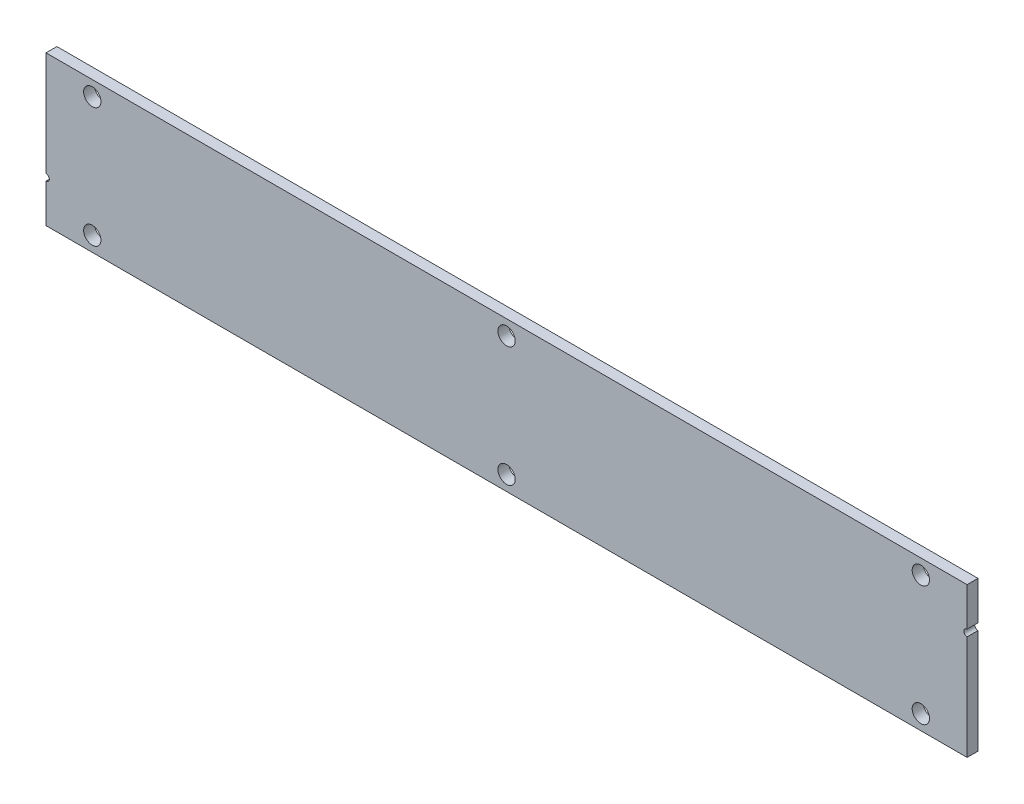
ISO-10303-21;
HEADER;
FILE_DESCRIPTION(('STEP AP214'),'2;1');
FILE_NAME('part.step','',(''),(''),'','','');
FILE_SCHEMA(('AUTOMOTIVE_DESIGN { 1 0 10303 214 1 1 1 1 }'));
ENDSEC;
DATA;
#1=APPLICATION_CONTEXT('core data for automotive mechanical design processes');
#2=APPLICATION_PROTOCOL_DEFINITION('international standard','automotive_design',2000,#1);
#3=PRODUCT_CONTEXT('',#1,'mechanical');
#4=PRODUCT('Part','Part','',(#3));
#5=PRODUCT_RELATED_PRODUCT_CATEGORY('part','',(#4));
#6=PRODUCT_DEFINITION_FORMATION('','',#4);
#7=PRODUCT_DEFINITION_CONTEXT('part definition',#1,'design');
#8=PRODUCT_DEFINITION('design','',#6,#7);
#9=PRODUCT_DEFINITION_SHAPE('','',#8);
#10=(LENGTH_UNIT() NAMED_UNIT(*) SI_UNIT(.MILLI.,.METRE.));
#11=(NAMED_UNIT(*) PLANE_ANGLE_UNIT() SI_UNIT($,.RADIAN.));
#12=(NAMED_UNIT(*) SI_UNIT($,.STERADIAN.) SOLID_ANGLE_UNIT());
#13=UNCERTAINTY_MEASURE_WITH_UNIT(LENGTH_MEASURE(1.E-05),#10,'distance_accuracy_value','');
#14=(GEOMETRIC_REPRESENTATION_CONTEXT(3) GLOBAL_UNCERTAINTY_ASSIGNED_CONTEXT((#13)) GLOBAL_UNIT_ASSIGNED_CONTEXT((#10,
#11,#12)) REPRESENTATION_CONTEXT('',''));
#15=CARTESIAN_POINT('',(0.,0.,0.));
#16=DIRECTION('',(0.,0.,1.));
#17=DIRECTION('',(1.,0.,0.));
#18=AXIS2_PLACEMENT_3D('',#15,#16,#17);
#19=CARTESIAN_POINT('',(69.85,5.00000000000001,1.651));
#20=DIRECTION('',(0.,0.,-1.));
#21=DIRECTION('',(-1.,0.,0.));
#22=AXIS2_PLACEMENT_3D('',#19,#20,#21);
#23=CYLINDRICAL_SURFACE('',#22,0.499999999999999);
#24=CARTESIAN_POINT('',(69.85,5.00000000000001,0.));
#25=DIRECTION('',(0.,0.,1.));
#26=DIRECTION('',(1.,0.,0.));
#27=AXIS2_PLACEMENT_3D('',#24,#25,#26);
#28=CIRCLE('',#27,0.499999999999999);
#29=CARTESIAN_POINT('',(69.85,5.50000000000001,0.));
#30=VERTEX_POINT('',#29);
#31=CARTESIAN_POINT('',(69.85,4.50000000000001,0.));
#32=VERTEX_POINT('',#31);
#33=EDGE_CURVE('E192',#30,#32,#28,.T.);
#34=ORIENTED_EDGE('',*,*,#33,.F.);
#35=DIRECTION('',(0.,0.,-1.));
#36=VECTOR('',#35,1.);
#37=CARTESIAN_POINT('',(69.85,5.50000000000001,1.651));
#38=LINE('',#37,#36);
#39=CARTESIAN_POINT('',(69.85,5.50000000000001,1.651));
#40=VERTEX_POINT('',#39);
#41=EDGE_CURVE('E11',#40,#30,#38,.T.);
#42=ORIENTED_EDGE('',*,*,#41,.F.);
#43=CARTESIAN_POINT('',(69.85,5.00000000000001,1.651));
#44=DIRECTION('',(0.,0.,1.));
#45=DIRECTION('',(1.,0.,0.));
#46=AXIS2_PLACEMENT_3D('',#43,#44,#45);
#47=CIRCLE('',#46,0.499999999999999);
#48=CARTESIAN_POINT('',(69.85,4.50000000000001,1.651));
#49=VERTEX_POINT('',#48);
#50=EDGE_CURVE('E148',#40,#49,#47,.T.);
#51=ORIENTED_EDGE('',*,*,#50,.T.);
#52=DIRECTION('',(0.,0.,-1.));
#53=VECTOR('',#52,1.);
#54=CARTESIAN_POINT('',(69.85,4.50000000000001,1.651));
#55=LINE('',#54,#53);
#56=EDGE_CURVE('E90',#49,#32,#55,.T.);
#57=ORIENTED_EDGE('',*,*,#56,.T.);
#58=EDGE_LOOP('',(#34,#42,#51,#57));
#59=FACE_BOUND('',#58,.T.);
#60=ADVANCED_FACE('F39',(#59),#23,.F.);
#61=CARTESIAN_POINT('',(69.85,0.,1.651));
#62=DIRECTION('',(-1.,0.,0.));
#63=DIRECTION('',(0.,0.,1.));
#64=AXIS2_PLACEMENT_3D('',#61,#62,#63);
#65=PLANE('',#64);
#66=DIRECTION('',(0.,1.,0.));
#67=VECTOR('',#66,1.);
#68=CARTESIAN_POINT('',(69.85,0.,0.));
#69=LINE('',#68,#67);
#70=CARTESIAN_POINT('',(69.85,11.35,0.));
#71=VERTEX_POINT('',#70);
#72=EDGE_CURVE('E187',#30,#71,#69,.T.);
#73=ORIENTED_EDGE('',*,*,#72,.T.);
#74=DIRECTION('',(0.,0.,-1.));
#75=VECTOR('',#74,1.);
#76=CARTESIAN_POINT('',(69.85,11.35,1.651));
#77=LINE('',#76,#75);
#78=CARTESIAN_POINT('',(69.85,11.35,1.651));
#79=VERTEX_POINT('',#78);
#80=EDGE_CURVE('E48',#79,#71,#77,.T.);
#81=ORIENTED_EDGE('',*,*,#80,.F.);
#82=DIRECTION('',(0.,1.,0.));
#83=VECTOR('',#82,1.);
#84=CARTESIAN_POINT('',(69.85,0.,1.651));
#85=LINE('',#84,#83);
#86=EDGE_CURVE('E144',#40,#79,#85,.T.);
#87=ORIENTED_EDGE('',*,*,#86,.F.);
#88=ORIENTED_EDGE('',*,*,#41,.T.);
#89=EDGE_LOOP('',(#73,#81,#87,#88));
#90=FACE_BOUND('',#89,.T.);
#91=ADVANCED_FACE('F188',(#90),#65,.F.);
#92=CARTESIAN_POINT('',(0.,11.35,1.651));
#93=DIRECTION('',(0.,1.,0.));
#94=DIRECTION('',(-1.,0.,0.));
#95=AXIS2_PLACEMENT_3D('',#92,#93,#94);
#96=PLANE('',#95);
#97=DIRECTION('',(1.,0.,0.));
#98=VECTOR('',#97,1.);
#99=CARTESIAN_POINT('',(0.,11.35,0.));
#100=LINE('',#99,#98);
#101=CARTESIAN_POINT('',(-69.85,11.35,0.));
#102=VERTEX_POINT('',#101);
#103=EDGE_CURVE('E183',#102,#71,#100,.T.);
#104=ORIENTED_EDGE('',*,*,#103,.F.);
#105=DIRECTION('',(0.,0.,-1.));
#106=VECTOR('',#105,1.);
#107=CARTESIAN_POINT('',(-69.85,11.35,1.651));
#108=LINE('',#107,#106);
#109=CARTESIAN_POINT('',(-69.85,11.35,1.651));
#110=VERTEX_POINT('',#109);
#111=EDGE_CURVE('E175',#110,#102,#108,.T.);
#112=ORIENTED_EDGE('',*,*,#111,.F.);
#113=DIRECTION('',(1.,0.,0.));
#114=VECTOR('',#113,1.);
#115=CARTESIAN_POINT('',(0.,11.35,1.651));
#116=LINE('',#115,#114);
#117=EDGE_CURVE('E140',#110,#79,#116,.T.);
#118=ORIENTED_EDGE('',*,*,#117,.T.);
#119=ORIENTED_EDGE('',*,*,#80,.T.);
#120=EDGE_LOOP('',(#104,#112,#118,#119));
#121=FACE_BOUND('',#120,.T.);
#122=ADVANCED_FACE('F181',(#121),#96,.T.);
#123=CARTESIAN_POINT('',(-69.85,0.,1.651));
#124=DIRECTION('',(-1.,0.,0.));
#125=DIRECTION('',(0.,0.,1.));
#126=AXIS2_PLACEMENT_3D('',#123,#124,#125);
#127=PLANE('',#126);
#128=DIRECTION('',(0.,1.,0.));
#129=VECTOR('',#128,1.);
#130=CARTESIAN_POINT('',(-69.85,0.,0.));
#131=LINE('',#130,#129);
#132=CARTESIAN_POINT('',(-69.85,-4.5,0.));
#133=VERTEX_POINT('',#132);
#134=EDGE_CURVE('E199',#133,#102,#131,.T.);
#135=ORIENTED_EDGE('',*,*,#134,.F.);
#136=DIRECTION('',(0.,0.,-1.));
#137=VECTOR('',#136,1.);
#138=CARTESIAN_POINT('',(-69.85,-4.5,1.651));
#139=LINE('',#138,#137);
#140=CARTESIAN_POINT('',(-69.85,-4.5,1.651));
#141=VERTEX_POINT('',#140);
#142=EDGE_CURVE('E172',#141,#133,#139,.T.);
#143=ORIENTED_EDGE('',*,*,#142,.F.);
#144=DIRECTION('',(0.,1.,0.));
#145=VECTOR('',#144,1.);
#146=CARTESIAN_POINT('',(-69.85,0.,1.651));
#147=LINE('',#146,#145);
#148=EDGE_CURVE('E134',#141,#110,#147,.T.);
#149=ORIENTED_EDGE('',*,*,#148,.T.);
#150=ORIENTED_EDGE('',*,*,#111,.T.);
#151=EDGE_LOOP('',(#135,#143,#149,#150));
#152=FACE_BOUND('',#151,.T.);
#153=ADVANCED_FACE('F370',(#152),#127,.T.);
#154=CARTESIAN_POINT('',(-69.85,-5.,1.651));
#155=DIRECTION('',(0.,0.,-1.));
#156=DIRECTION('',(-1.,0.,0.));
#157=AXIS2_PLACEMENT_3D('',#154,#155,#156);
#158=CYLINDRICAL_SURFACE('',#157,0.499999999999999);
#159=CARTESIAN_POINT('',(-69.85,-5.,0.));
#160=DIRECTION('',(0.,0.,1.));
#161=DIRECTION('',(1.,0.,0.));
#162=AXIS2_PLACEMENT_3D('',#159,#160,#161);
#163=CIRCLE('',#162,0.499999999999999);
#164=CARTESIAN_POINT('',(-69.85,-5.49999999999999,0.));
#165=VERTEX_POINT('',#164);
#166=EDGE_CURVE('E203',#165,#133,#163,.T.);
#167=ORIENTED_EDGE('',*,*,#166,.F.);
#168=DIRECTION('',(0.,0.,-1.));
#169=VECTOR('',#168,1.);
#170=CARTESIAN_POINT('',(-69.85,-5.49999999999999,1.651));
#171=LINE('',#170,#169);
#172=CARTESIAN_POINT('',(-69.85,-5.49999999999999,1.651));
#173=VERTEX_POINT('',#172);
#174=EDGE_CURVE('E119',#173,#165,#171,.T.);
#175=ORIENTED_EDGE('',*,*,#174,.F.);
#176=CARTESIAN_POINT('',(-69.85,-5.,1.651));
#177=DIRECTION('',(0.,0.,1.));
#178=DIRECTION('',(1.,0.,0.));
#179=AXIS2_PLACEMENT_3D('',#176,#177,#178);
#180=CIRCLE('',#179,0.499999999999999);
#181=EDGE_CURVE('E131',#173,#141,#180,.T.);
#182=ORIENTED_EDGE('',*,*,#181,.T.);
#183=ORIENTED_EDGE('',*,*,#142,.T.);
#184=EDGE_LOOP('',(#167,#175,#182,#183));
#185=FACE_BOUND('',#184,.T.);
#186=ADVANCED_FACE('F368',(#185),#158,.F.);
#187=CARTESIAN_POINT('',(-69.85,-11.35,0.));
#188=VERTEX_POINT('',#187);
#189=EDGE_CURVE('E117',#188,#165,#131,.T.);
#190=ORIENTED_EDGE('',*,*,#189,.F.);
#191=DIRECTION('',(0.,0.,-1.));
#192=VECTOR('',#191,1.);
#193=CARTESIAN_POINT('',(-69.85,-11.35,1.651));
#194=LINE('',#193,#192);
#195=CARTESIAN_POINT('',(-69.85,-11.35,1.651));
#196=VERTEX_POINT('',#195);
#197=EDGE_CURVE('E111',#196,#188,#194,.T.);
#198=ORIENTED_EDGE('',*,*,#197,.F.);
#199=EDGE_CURVE('E115',#196,#173,#147,.T.);
#200=ORIENTED_EDGE('',*,*,#199,.T.);
#201=ORIENTED_EDGE('',*,*,#174,.T.);
#202=EDGE_LOOP('',(#190,#198,#200,#201));
#203=FACE_BOUND('',#202,.T.);
#204=ADVANCED_FACE('F113',(#203),#127,.T.);
#205=CARTESIAN_POINT('',(0.,-11.35,1.651));
#206=DIRECTION('',(0.,1.,0.));
#207=DIRECTION('',(0.,0.,1.));
#208=AXIS2_PLACEMENT_3D('',#205,#206,#207);
#209=PLANE('',#208);
#210=DIRECTION('',(1.,0.,0.));
#211=VECTOR('',#210,1.);
#212=CARTESIAN_POINT('',(0.,-11.35,0.));
#213=LINE('',#212,#211);
#214=CARTESIAN_POINT('',(69.85,-11.35,0.));
#215=VERTEX_POINT('',#214);
#216=EDGE_CURVE('E83',#188,#215,#213,.T.);
#217=ORIENTED_EDGE('',*,*,#216,.T.);
#218=DIRECTION('',(0.,0.,-1.));
#219=VECTOR('',#218,1.);
#220=CARTESIAN_POINT('',(69.85,-11.35,1.651));
#221=LINE('',#220,#219);
#222=CARTESIAN_POINT('',(69.85,-11.35,1.651));
#223=VERTEX_POINT('',#222);
#224=EDGE_CURVE('E120',#223,#215,#221,.T.);
#225=ORIENTED_EDGE('',*,*,#224,.F.);
#226=DIRECTION('',(1.,0.,0.));
#227=VECTOR('',#226,1.);
#228=CARTESIAN_POINT('',(0.,-11.35,1.651));
#229=LINE('',#228,#227);
#230=EDGE_CURVE('E122',#196,#223,#229,.T.);
#231=ORIENTED_EDGE('',*,*,#230,.F.);
#232=ORIENTED_EDGE('',*,*,#197,.T.);
#233=EDGE_LOOP('',(#217,#225,#231,#232));
#234=FACE_BOUND('',#233,.T.);
#235=ADVANCED_FACE('F123',(#234),#209,.F.);
#236=CARTESIAN_POINT('',(0.,9.1,1.651));
#237=DIRECTION('',(0.,0.,-1.));
#238=DIRECTION('',(-1.,0.,0.));
#239=AXIS2_PLACEMENT_3D('',#236,#237,#238);
#240=CYLINDRICAL_SURFACE('',#239,1.3125);
#241=CARTESIAN_POINT('',(0.,9.1,1.651));
#242=DIRECTION('',(0.,0.,1.));
#243=DIRECTION('',(1.,0.,0.));
#244=AXIS2_PLACEMENT_3D('',#241,#242,#243);
#245=CIRCLE('',#244,1.3125);
#246=CARTESIAN_POINT('',(-1.3125,9.1,1.651));
#247=VERTEX_POINT('',#246);
#248=EDGE_CURVE('E256',#247,#247,#245,.T.);
#249=CARTESIAN_POINT('',(0.,9.1,0.));
#250=DIRECTION('',(0.,0.,1.));
#251=DIRECTION('',(1.,0.,0.));
#252=AXIS2_PLACEMENT_3D('',#249,#250,#251);
#253=CIRCLE('',#252,1.3125);
#254=CARTESIAN_POINT('',(-1.3125,9.1,0.));
#255=VERTEX_POINT('',#254);
#256=EDGE_CURVE('E155',#255,#255,#253,.T.);
#257=CARTESIAN_POINT('',(-1.3125,9.1,1.651));
#258=CARTESIAN_POINT('',(-1.3125,9.1,1.63380208333333));
#259=CARTESIAN_POINT('',(-1.3125,9.1,1.61660416666667));
#260=CARTESIAN_POINT('',(-1.3125,9.1,1.58220833333333));
#261=CARTESIAN_POINT('',(-1.3125,9.1,1.56501041666667));
#262=CARTESIAN_POINT('',(-1.3125,9.1,1.53061458333333));
#263=CARTESIAN_POINT('',(-1.3125,9.1,1.51341666666667));
#264=CARTESIAN_POINT('',(-1.3125,9.1,1.47902083333333));
#265=CARTESIAN_POINT('',(-1.3125,9.1,1.46182291666667));
#266=CARTESIAN_POINT('',(-1.3125,9.1,1.42742708333333));
#267=CARTESIAN_POINT('',(-1.3125,9.1,1.41022916666667));
#268=CARTESIAN_POINT('',(-1.3125,9.1,1.37583333333333));
#269=CARTESIAN_POINT('',(-1.3125,9.1,1.35863541666667));
#270=CARTESIAN_POINT('',(-1.3125,9.1,1.32423958333333));
#271=CARTESIAN_POINT('',(-1.3125,9.1,1.30704166666667));
#272=CARTESIAN_POINT('',(-1.3125,9.1,1.27264583333333));
#273=CARTESIAN_POINT('',(-1.3125,9.1,1.25544791666667));
#274=CARTESIAN_POINT('',(-1.3125,9.1,1.22105208333333));
#275=CARTESIAN_POINT('',(-1.3125,9.1,1.20385416666667));
#276=CARTESIAN_POINT('',(-1.3125,9.1,1.16945833333333));
#277=CARTESIAN_POINT('',(-1.3125,9.1,1.15226041666667));
#278=CARTESIAN_POINT('',(-1.3125,9.1,1.11786458333333));
#279=CARTESIAN_POINT('',(-1.3125,9.1,1.10066666666667));
#280=CARTESIAN_POINT('',(-1.3125,9.1,1.06627083333333));
#281=CARTESIAN_POINT('',(-1.3125,9.1,1.04907291666667));
#282=CARTESIAN_POINT('',(-1.3125,9.1,1.01467708333333));
#283=CARTESIAN_POINT('',(-1.3125,9.1,0.997479166666666));
#284=CARTESIAN_POINT('',(-1.3125,9.1,0.963083333333333));
#285=CARTESIAN_POINT('',(-1.3125,9.1,0.945885416666667));
#286=CARTESIAN_POINT('',(-1.3125,9.1,0.911489583333333));
#287=CARTESIAN_POINT('',(-1.3125,9.1,0.894291666666667));
#288=CARTESIAN_POINT('',(-1.3125,9.1,0.859895833333333));
#289=CARTESIAN_POINT('',(-1.3125,9.1,0.842697916666667));
#290=CARTESIAN_POINT('',(-1.3125,9.1,0.808302083333333));
#291=CARTESIAN_POINT('',(-1.3125,9.1,0.791104166666667));
#292=CARTESIAN_POINT('',(-1.3125,9.1,0.756708333333333));
#293=CARTESIAN_POINT('',(-1.3125,9.1,0.739510416666667));
#294=CARTESIAN_POINT('',(-1.3125,9.1,0.705114583333333));
#295=CARTESIAN_POINT('',(-1.3125,9.1,0.687916666666667));
#296=CARTESIAN_POINT('',(-1.3125,9.1,0.653520833333333));
#297=CARTESIAN_POINT('',(-1.3125,9.1,0.636322916666667));
#298=CARTESIAN_POINT('',(-1.3125,9.1,0.601927083333333));
#299=CARTESIAN_POINT('',(-1.3125,9.1,0.584729166666667));
#300=CARTESIAN_POINT('',(-1.3125,9.1,0.550333333333333));
#301=CARTESIAN_POINT('',(-1.3125,9.1,0.533135416666667));
#302=CARTESIAN_POINT('',(-1.3125,9.1,0.498739583333333));
#303=CARTESIAN_POINT('',(-1.3125,9.1,0.481541666666667));
#304=CARTESIAN_POINT('',(-1.3125,9.1,0.447145833333333));
#305=CARTESIAN_POINT('',(-1.3125,9.1,0.429947916666667));
#306=CARTESIAN_POINT('',(-1.3125,9.1,0.395552083333333));
#307=CARTESIAN_POINT('',(-1.3125,9.1,0.378354166666667));
#308=CARTESIAN_POINT('',(-1.3125,9.1,0.343958333333333));
#309=CARTESIAN_POINT('',(-1.3125,9.1,0.326760416666667));
#310=CARTESIAN_POINT('',(-1.3125,9.1,0.292364583333333));
#311=CARTESIAN_POINT('',(-1.3125,9.1,0.275166666666667));
#312=CARTESIAN_POINT('',(-1.3125,9.1,0.240770833333333));
#313=CARTESIAN_POINT('',(-1.3125,9.1,0.223572916666667));
#314=CARTESIAN_POINT('',(-1.3125,9.1,0.189177083333333));
#315=CARTESIAN_POINT('',(-1.3125,9.1,0.171979166666667));
#316=CARTESIAN_POINT('',(-1.3125,9.1,0.137583333333333));
#317=CARTESIAN_POINT('',(-1.3125,9.1,0.120385416666667));
#318=CARTESIAN_POINT('',(-1.3125,9.1,0.0859895833333333));
#319=CARTESIAN_POINT('',(-1.3125,9.1,0.0687916666666667));
#320=CARTESIAN_POINT('',(-1.3125,9.1,0.0343958333333333));
#321=CARTESIAN_POINT('',(-1.3125,9.1,0.0171979166666666));
#322=CARTESIAN_POINT('',(-1.3125,9.1,0.));
#323=B_SPLINE_CURVE_WITH_KNOTS('',3,(#257,#258,#259,#260,#261,#262,#263,#264,#265,#266,#267,
#268,#269,#270,#271,#272,#273,#274,#275,#276,#277,#278,#279,#280,#281,#282,#283,#284,#285,#286,
#287,#288,#289,#290,#291,#292,#293,#294,#295,#296,#297,#298,#299,#300,#301,#302,#303,#304,#305,
#306,#307,#308,#309,#310,#311,#312,#313,#314,#315,#316,#317,#318,#319,#320,#321,#322),
.UNSPECIFIED.,.F.,.F.,(4,2,2,2,2,2,2,2,2,2,2,2,2,2,2,2,2,2,2,2,2,2,2,2,2,2,2,2,2,2,2,2,4),(0.,
0.05159375,0.1031875,0.15478125,0.206375,0.25796875,0.3095625,0.36115625,0.41275,0.46434375,
0.5159375,0.56753125,0.619125,0.67071875,0.7223125,0.77390625,0.8255,0.87709375,0.9286875,
0.98028125,1.031875,1.08346875,1.1350625,1.18665625,1.23825,1.28984375,1.3414375,1.39303125,
1.444625,1.49621875,1.5478125,1.59940625,1.651),.UNSPECIFIED.);
#324=EDGE_CURVE('BSEAM231',#247,#255,#323,.T.);
#325=ORIENTED_EDGE('',*,*,#248,.T.);
#326=ORIENTED_EDGE('',*,*,#256,.F.);
#327=ORIENTED_EDGE('',*,*,#324,.T.);
#328=ORIENTED_EDGE('',*,*,#324,.F.);
#329=EDGE_LOOP('',(#325,#327,#326,#328));
#330=FACE_BOUND('',#329,.T.);
#331=ADVANCED_FACE('F231',(#330),#240,.F.);
#332=CARTESIAN_POINT('',(-62.83,-9.1,1.651));
#333=DIRECTION('',(0.,0.,-1.));
#334=DIRECTION('',(-1.,0.,0.));
#335=AXIS2_PLACEMENT_3D('',#332,#333,#334);
#336=CYLINDRICAL_SURFACE('',#335,1.3125);
#337=CARTESIAN_POINT('',(-62.83,-9.1,1.651));
#338=DIRECTION('',(0.,0.,1.));
#339=DIRECTION('',(1.,0.,0.));
#340=AXIS2_PLACEMENT_3D('',#337,#338,#339);
#341=CIRCLE('',#340,1.3125);
#342=CARTESIAN_POINT('',(-64.1425,-9.1,1.651));
#343=VERTEX_POINT('',#342);
#344=EDGE_CURVE('E260',#343,#343,#341,.T.);
#345=CARTESIAN_POINT('',(-62.83,-9.1,0.));
#346=DIRECTION('',(0.,0.,1.));
#347=DIRECTION('',(1.,0.,0.));
#348=AXIS2_PLACEMENT_3D('',#345,#346,#347);
#349=CIRCLE('',#348,1.3125);
#350=CARTESIAN_POINT('',(-64.1425,-9.1,0.));
#351=VERTEX_POINT('',#350);
#352=EDGE_CURVE('E161',#351,#351,#349,.T.);
#353=CARTESIAN_POINT('',(-64.1425,-9.1,1.651));
#354=CARTESIAN_POINT('',(-64.1425,-9.1,1.63380208333333));
#355=CARTESIAN_POINT('',(-64.1425,-9.1,1.61660416666667));
#356=CARTESIAN_POINT('',(-64.1425,-9.1,1.58220833333333));
#357=CARTESIAN_POINT('',(-64.1425,-9.1,1.56501041666667));
#358=CARTESIAN_POINT('',(-64.1425,-9.1,1.53061458333333));
#359=CARTESIAN_POINT('',(-64.1425,-9.1,1.51341666666667));
#360=CARTESIAN_POINT('',(-64.1425,-9.1,1.47902083333333));
#361=CARTESIAN_POINT('',(-64.1425,-9.1,1.46182291666667));
#362=CARTESIAN_POINT('',(-64.1425,-9.1,1.42742708333333));
#363=CARTESIAN_POINT('',(-64.1425,-9.1,1.41022916666667));
#364=CARTESIAN_POINT('',(-64.1425,-9.1,1.37583333333333));
#365=CARTESIAN_POINT('',(-64.1425,-9.1,1.35863541666667));
#366=CARTESIAN_POINT('',(-64.1425,-9.1,1.32423958333333));
#367=CARTESIAN_POINT('',(-64.1425,-9.1,1.30704166666667));
#368=CARTESIAN_POINT('',(-64.1425,-9.1,1.27264583333333));
#369=CARTESIAN_POINT('',(-64.1425,-9.1,1.25544791666667));
#370=CARTESIAN_POINT('',(-64.1425,-9.1,1.22105208333333));
#371=CARTESIAN_POINT('',(-64.1425,-9.1,1.20385416666667));
#372=CARTESIAN_POINT('',(-64.1425,-9.1,1.16945833333333));
#373=CARTESIAN_POINT('',(-64.1425,-9.1,1.15226041666667));
#374=CARTESIAN_POINT('',(-64.1425,-9.1,1.11786458333333));
#375=CARTESIAN_POINT('',(-64.1425,-9.1,1.10066666666667));
#376=CARTESIAN_POINT('',(-64.1425,-9.1,1.06627083333333));
#377=CARTESIAN_POINT('',(-64.1425,-9.1,1.04907291666667));
#378=CARTESIAN_POINT('',(-64.1425,-9.1,1.01467708333333));
#379=CARTESIAN_POINT('',(-64.1425,-9.1,0.997479166666666));
#380=CARTESIAN_POINT('',(-64.1425,-9.1,0.963083333333333));
#381=CARTESIAN_POINT('',(-64.1425,-9.1,0.945885416666667));
#382=CARTESIAN_POINT('',(-64.1425,-9.1,0.911489583333333));
#383=CARTESIAN_POINT('',(-64.1425,-9.1,0.894291666666667));
#384=CARTESIAN_POINT('',(-64.1425,-9.1,0.859895833333333));
#385=CARTESIAN_POINT('',(-64.1425,-9.1,0.842697916666667));
#386=CARTESIAN_POINT('',(-64.1425,-9.1,0.808302083333333));
#387=CARTESIAN_POINT('',(-64.1425,-9.1,0.791104166666667));
#388=CARTESIAN_POINT('',(-64.1425,-9.1,0.756708333333333));
#389=CARTESIAN_POINT('',(-64.1425,-9.1,0.739510416666667));
#390=CARTESIAN_POINT('',(-64.1425,-9.1,0.705114583333333));
#391=CARTESIAN_POINT('',(-64.1425,-9.1,0.687916666666667));
#392=CARTESIAN_POINT('',(-64.1425,-9.1,0.653520833333333));
#393=CARTESIAN_POINT('',(-64.1425,-9.1,0.636322916666667));
#394=CARTESIAN_POINT('',(-64.1425,-9.1,0.601927083333333));
#395=CARTESIAN_POINT('',(-64.1425,-9.1,0.584729166666667));
#396=CARTESIAN_POINT('',(-64.1425,-9.1,0.550333333333333));
#397=CARTESIAN_POINT('',(-64.1425,-9.1,0.533135416666667));
#398=CARTESIAN_POINT('',(-64.1425,-9.1,0.498739583333333));
#399=CARTESIAN_POINT('',(-64.1425,-9.1,0.481541666666667));
#400=CARTESIAN_POINT('',(-64.1425,-9.1,0.447145833333333));
#401=CARTESIAN_POINT('',(-64.1425,-9.1,0.429947916666667));
#402=CARTESIAN_POINT('',(-64.1425,-9.1,0.395552083333333));
#403=CARTESIAN_POINT('',(-64.1425,-9.1,0.378354166666667));
#404=CARTESIAN_POINT('',(-64.1425,-9.1,0.343958333333333));
#405=CARTESIAN_POINT('',(-64.1425,-9.1,0.326760416666667));
#406=CARTESIAN_POINT('',(-64.1425,-9.1,0.292364583333333));
#407=CARTESIAN_POINT('',(-64.1425,-9.1,0.275166666666667));
#408=CARTESIAN_POINT('',(-64.1425,-9.1,0.240770833333333));
#409=CARTESIAN_POINT('',(-64.1425,-9.1,0.223572916666667));
#410=CARTESIAN_POINT('',(-64.1425,-9.1,0.189177083333333));
#411=CARTESIAN_POINT('',(-64.1425,-9.1,0.171979166666667));
#412=CARTESIAN_POINT('',(-64.1425,-9.1,0.137583333333333));
#413=CARTESIAN_POINT('',(-64.1425,-9.1,0.120385416666667));
#414=CARTESIAN_POINT('',(-64.1425,-9.1,0.0859895833333333));
#415=CARTESIAN_POINT('',(-64.1425,-9.1,0.0687916666666667));
#416=CARTESIAN_POINT('',(-64.1425,-9.1,0.0343958333333333));
#417=CARTESIAN_POINT('',(-64.1425,-9.1,0.0171979166666666));
#418=CARTESIAN_POINT('',(-64.1425,-9.1,0.));
#419=B_SPLINE_CURVE_WITH_KNOTS('',3,(#353,#354,#355,#356,#357,#358,#359,#360,#361,#362,#363,
#364,#365,#366,#367,#368,#369,#370,#371,#372,#373,#374,#375,#376,#377,#378,#379,#380,#381,#382,
#383,#384,#385,#386,#387,#388,#389,#390,#391,#392,#393,#394,#395,#396,#397,#398,#399,#400,#401,
#402,#403,#404,#405,#406,#407,#408,#409,#410,#411,#412,#413,#414,#415,#416,#417,#418),
.UNSPECIFIED.,.F.,.F.,(4,2,2,2,2,2,2,2,2,2,2,2,2,2,2,2,2,2,2,2,2,2,2,2,2,2,2,2,2,2,2,2,4),(0.,
0.05159375,0.1031875,0.15478125,0.206375,0.25796875,0.3095625,0.36115625,0.41275,0.46434375,
0.5159375,0.56753125,0.619125,0.67071875,0.7223125,0.77390625,0.8255,0.87709375,0.9286875,
0.98028125,1.031875,1.08346875,1.1350625,1.18665625,1.23825,1.28984375,1.3414375,1.39303125,
1.444625,1.49621875,1.5478125,1.59940625,1.651),.UNSPECIFIED.);
#420=EDGE_CURVE('BSEAM228',#343,#351,#419,.T.);
#421=ORIENTED_EDGE('',*,*,#344,.T.);
#422=ORIENTED_EDGE('',*,*,#352,.F.);
#423=ORIENTED_EDGE('',*,*,#420,.T.);
#424=ORIENTED_EDGE('',*,*,#420,.F.);
#425=EDGE_LOOP('',(#421,#423,#422,#424));
#426=FACE_BOUND('',#425,.T.);
#427=ADVANCED_FACE('F228',(#426),#336,.F.);
#428=CARTESIAN_POINT('',(-62.83,9.1,1.651));
#429=DIRECTION('',(0.,0.,-1.));
#430=DIRECTION('',(-1.,0.,0.));
#431=AXIS2_PLACEMENT_3D('',#428,#429,#430);
#432=CYLINDRICAL_SURFACE('',#431,1.3125);
#433=CARTESIAN_POINT('',(-62.83,9.1,1.651));
#434=DIRECTION('',(0.,0.,1.));
#435=DIRECTION('',(1.,0.,0.));
#436=AXIS2_PLACEMENT_3D('',#433,#434,#435);
#437=CIRCLE('',#436,1.3125);
#438=CARTESIAN_POINT('',(-64.1425,9.1,1.651));
#439=VERTEX_POINT('',#438);
#440=EDGE_CURVE('E263',#439,#439,#437,.T.);
#441=CARTESIAN_POINT('',(-62.83,9.1,0.));
#442=DIRECTION('',(0.,0.,1.));
#443=DIRECTION('',(1.,0.,0.));
#444=AXIS2_PLACEMENT_3D('',#441,#442,#443);
#445=CIRCLE('',#444,1.3125);
#446=CARTESIAN_POINT('',(-64.1425,9.1,0.));
#447=VERTEX_POINT('',#446);
#448=EDGE_CURVE('E219',#447,#447,#445,.T.);
#449=CARTESIAN_POINT('',(-64.1425,9.1,1.651));
#450=CARTESIAN_POINT('',(-64.1425,9.1,1.63380208333333));
#451=CARTESIAN_POINT('',(-64.1425,9.1,1.61660416666667));
#452=CARTESIAN_POINT('',(-64.1425,9.1,1.58220833333333));
#453=CARTESIAN_POINT('',(-64.1425,9.1,1.56501041666667));
#454=CARTESIAN_POINT('',(-64.1425,9.1,1.53061458333333));
#455=CARTESIAN_POINT('',(-64.1425,9.1,1.51341666666667));
#456=CARTESIAN_POINT('',(-64.1425,9.1,1.47902083333333));
#457=CARTESIAN_POINT('',(-64.1425,9.1,1.46182291666667));
#458=CARTESIAN_POINT('',(-64.1425,9.1,1.42742708333333));
#459=CARTESIAN_POINT('',(-64.1425,9.1,1.41022916666667));
#460=CARTESIAN_POINT('',(-64.1425,9.1,1.37583333333333));
#461=CARTESIAN_POINT('',(-64.1425,9.1,1.35863541666667));
#462=CARTESIAN_POINT('',(-64.1425,9.1,1.32423958333333));
#463=CARTESIAN_POINT('',(-64.1425,9.1,1.30704166666667));
#464=CARTESIAN_POINT('',(-64.1425,9.1,1.27264583333333));
#465=CARTESIAN_POINT('',(-64.1425,9.1,1.25544791666667));
#466=CARTESIAN_POINT('',(-64.1425,9.1,1.22105208333333));
#467=CARTESIAN_POINT('',(-64.1425,9.1,1.20385416666667));
#468=CARTESIAN_POINT('',(-64.1425,9.1,1.16945833333333));
#469=CARTESIAN_POINT('',(-64.1425,9.1,1.15226041666667));
#470=CARTESIAN_POINT('',(-64.1425,9.1,1.11786458333333));
#471=CARTESIAN_POINT('',(-64.1425,9.1,1.10066666666667));
#472=CARTESIAN_POINT('',(-64.1425,9.1,1.06627083333333));
#473=CARTESIAN_POINT('',(-64.1425,9.1,1.04907291666667));
#474=CARTESIAN_POINT('',(-64.1425,9.1,1.01467708333333));
#475=CARTESIAN_POINT('',(-64.1425,9.1,0.997479166666666));
#476=CARTESIAN_POINT('',(-64.1425,9.1,0.963083333333333));
#477=CARTESIAN_POINT('',(-64.1425,9.1,0.945885416666667));
#478=CARTESIAN_POINT('',(-64.1425,9.1,0.911489583333333));
#479=CARTESIAN_POINT('',(-64.1425,9.1,0.894291666666667));
#480=CARTESIAN_POINT('',(-64.1425,9.1,0.859895833333333));
#481=CARTESIAN_POINT('',(-64.1425,9.1,0.842697916666667));
#482=CARTESIAN_POINT('',(-64.1425,9.1,0.808302083333333));
#483=CARTESIAN_POINT('',(-64.1425,9.1,0.791104166666667));
#484=CARTESIAN_POINT('',(-64.1425,9.1,0.756708333333333));
#485=CARTESIAN_POINT('',(-64.1425,9.1,0.739510416666667));
#486=CARTESIAN_POINT('',(-64.1425,9.1,0.705114583333333));
#487=CARTESIAN_POINT('',(-64.1425,9.1,0.687916666666667));
#488=CARTESIAN_POINT('',(-64.1425,9.1,0.653520833333333));
#489=CARTESIAN_POINT('',(-64.1425,9.1,0.636322916666667));
#490=CARTESIAN_POINT('',(-64.1425,9.1,0.601927083333333));
#491=CARTESIAN_POINT('',(-64.1425,9.1,0.584729166666667));
#492=CARTESIAN_POINT('',(-64.1425,9.1,0.550333333333333));
#493=CARTESIAN_POINT('',(-64.1425,9.1,0.533135416666667));
#494=CARTESIAN_POINT('',(-64.1425,9.1,0.498739583333333));
#495=CARTESIAN_POINT('',(-64.1425,9.1,0.481541666666667));
#496=CARTESIAN_POINT('',(-64.1425,9.1,0.447145833333333));
#497=CARTESIAN_POINT('',(-64.1425,9.1,0.429947916666667));
#498=CARTESIAN_POINT('',(-64.1425,9.1,0.395552083333333));
#499=CARTESIAN_POINT('',(-64.1425,9.1,0.378354166666667));
#500=CARTESIAN_POINT('',(-64.1425,9.1,0.343958333333333));
#501=CARTESIAN_POINT('',(-64.1425,9.1,0.326760416666667));
#502=CARTESIAN_POINT('',(-64.1425,9.1,0.292364583333333));
#503=CARTESIAN_POINT('',(-64.1425,9.1,0.275166666666667));
#504=CARTESIAN_POINT('',(-64.1425,9.1,0.240770833333333));
#505=CARTESIAN_POINT('',(-64.1425,9.1,0.223572916666667));
#506=CARTESIAN_POINT('',(-64.1425,9.1,0.189177083333333));
#507=CARTESIAN_POINT('',(-64.1425,9.1,0.171979166666667));
#508=CARTESIAN_POINT('',(-64.1425,9.1,0.137583333333333));
#509=CARTESIAN_POINT('',(-64.1425,9.1,0.120385416666667));
#510=CARTESIAN_POINT('',(-64.1425,9.1,0.0859895833333333));
#511=CARTESIAN_POINT('',(-64.1425,9.1,0.0687916666666667));
#512=CARTESIAN_POINT('',(-64.1425,9.1,0.0343958333333333));
#513=CARTESIAN_POINT('',(-64.1425,9.1,0.0171979166666666));
#514=CARTESIAN_POINT('',(-64.1425,9.1,0.));
#515=B_SPLINE_CURVE_WITH_KNOTS('',3,(#449,#450,#451,#452,#453,#454,#455,#456,#457,#458,#459,
#460,#461,#462,#463,#464,#465,#466,#467,#468,#469,#470,#471,#472,#473,#474,#475,#476,#477,#478,
#479,#480,#481,#482,#483,#484,#485,#486,#487,#488,#489,#490,#491,#492,#493,#494,#495,#496,#497,
#498,#499,#500,#501,#502,#503,#504,#505,#506,#507,#508,#509,#510,#511,#512,#513,#514),
.UNSPECIFIED.,.F.,.F.,(4,2,2,2,2,2,2,2,2,2,2,2,2,2,2,2,2,2,2,2,2,2,2,2,2,2,2,2,2,2,2,2,4),(0.,
0.05159375,0.1031875,0.15478125,0.206375,0.25796875,0.3095625,0.36115625,0.41275,0.46434375,
0.5159375,0.56753125,0.619125,0.67071875,0.7223125,0.77390625,0.8255,0.87709375,0.9286875,
0.98028125,1.031875,1.08346875,1.1350625,1.18665625,1.23825,1.28984375,1.3414375,1.39303125,
1.444625,1.49621875,1.5478125,1.59940625,1.651),.UNSPECIFIED.);
#516=EDGE_CURVE('BSEAM230',#439,#447,#515,.T.);
#517=ORIENTED_EDGE('',*,*,#440,.T.);
#518=ORIENTED_EDGE('',*,*,#448,.F.);
#519=ORIENTED_EDGE('',*,*,#516,.T.);
#520=ORIENTED_EDGE('',*,*,#516,.F.);
#521=EDGE_LOOP('',(#517,#519,#518,#520));
#522=FACE_BOUND('',#521,.T.);
#523=ADVANCED_FACE('F230',(#522),#432,.F.);
#524=CARTESIAN_POINT('',(62.83,-9.1,1.651));
#525=DIRECTION('',(0.,0.,-1.));
#526=DIRECTION('',(-1.,0.,0.));
#527=AXIS2_PLACEMENT_3D('',#524,#525,#526);
#528=CYLINDRICAL_SURFACE('',#527,1.3125);
#529=CARTESIAN_POINT('',(62.83,-9.1,1.651));
#530=DIRECTION('',(0.,0.,1.));
#531=DIRECTION('',(1.,0.,0.));
#532=AXIS2_PLACEMENT_3D('',#529,#530,#531);
#533=CIRCLE('',#532,1.3125);
#534=CARTESIAN_POINT('',(61.5175,-9.1,1.651));
#535=VERTEX_POINT('',#534);
#536=EDGE_CURVE('E267',#535,#535,#533,.T.);
#537=CARTESIAN_POINT('',(62.83,-9.1,0.));
#538=DIRECTION('',(0.,0.,1.));
#539=DIRECTION('',(1.,0.,0.));
#540=AXIS2_PLACEMENT_3D('',#537,#538,#539);
#541=CIRCLE('',#540,1.3125);
#542=CARTESIAN_POINT('',(61.5175,-9.1,0.));
#543=VERTEX_POINT('',#542);
#544=EDGE_CURVE('E215',#543,#543,#541,.T.);
#545=CARTESIAN_POINT('',(61.5175,-9.1,1.651));
#546=CARTESIAN_POINT('',(61.5175,-9.1,1.63380208333333));
#547=CARTESIAN_POINT('',(61.5175,-9.1,1.61660416666667));
#548=CARTESIAN_POINT('',(61.5175,-9.1,1.58220833333333));
#549=CARTESIAN_POINT('',(61.5175,-9.1,1.56501041666667));
#550=CARTESIAN_POINT('',(61.5175,-9.1,1.53061458333333));
#551=CARTESIAN_POINT('',(61.5175,-9.1,1.51341666666667));
#552=CARTESIAN_POINT('',(61.5175,-9.1,1.47902083333333));
#553=CARTESIAN_POINT('',(61.5175,-9.1,1.46182291666667));
#554=CARTESIAN_POINT('',(61.5175,-9.1,1.42742708333333));
#555=CARTESIAN_POINT('',(61.5175,-9.1,1.41022916666667));
#556=CARTESIAN_POINT('',(61.5175,-9.1,1.37583333333333));
#557=CARTESIAN_POINT('',(61.5175,-9.1,1.35863541666667));
#558=CARTESIAN_POINT('',(61.5175,-9.1,1.32423958333333));
#559=CARTESIAN_POINT('',(61.5175,-9.1,1.30704166666667));
#560=CARTESIAN_POINT('',(61.5175,-9.1,1.27264583333333));
#561=CARTESIAN_POINT('',(61.5175,-9.1,1.25544791666667));
#562=CARTESIAN_POINT('',(61.5175,-9.1,1.22105208333333));
#563=CARTESIAN_POINT('',(61.5175,-9.1,1.20385416666667));
#564=CARTESIAN_POINT('',(61.5175,-9.1,1.16945833333333));
#565=CARTESIAN_POINT('',(61.5175,-9.1,1.15226041666667));
#566=CARTESIAN_POINT('',(61.5175,-9.1,1.11786458333333));
#567=CARTESIAN_POINT('',(61.5175,-9.1,1.10066666666667));
#568=CARTESIAN_POINT('',(61.5175,-9.1,1.06627083333333));
#569=CARTESIAN_POINT('',(61.5175,-9.1,1.04907291666667));
#570=CARTESIAN_POINT('',(61.5175,-9.1,1.01467708333333));
#571=CARTESIAN_POINT('',(61.5175,-9.1,0.997479166666666));
#572=CARTESIAN_POINT('',(61.5175,-9.1,0.963083333333333));
#573=CARTESIAN_POINT('',(61.5175,-9.1,0.945885416666667));
#574=CARTESIAN_POINT('',(61.5175,-9.1,0.911489583333333));
#575=CARTESIAN_POINT('',(61.5175,-9.1,0.894291666666667));
#576=CARTESIAN_POINT('',(61.5175,-9.1,0.859895833333333));
#577=CARTESIAN_POINT('',(61.5175,-9.1,0.842697916666667));
#578=CARTESIAN_POINT('',(61.5175,-9.1,0.808302083333333));
#579=CARTESIAN_POINT('',(61.5175,-9.1,0.791104166666667));
#580=CARTESIAN_POINT('',(61.5175,-9.1,0.756708333333333));
#581=CARTESIAN_POINT('',(61.5175,-9.1,0.739510416666667));
#582=CARTESIAN_POINT('',(61.5175,-9.1,0.705114583333333));
#583=CARTESIAN_POINT('',(61.5175,-9.1,0.687916666666667));
#584=CARTESIAN_POINT('',(61.5175,-9.1,0.653520833333333));
#585=CARTESIAN_POINT('',(61.5175,-9.1,0.636322916666667));
#586=CARTESIAN_POINT('',(61.5175,-9.1,0.601927083333333));
#587=CARTESIAN_POINT('',(61.5175,-9.1,0.584729166666667));
#588=CARTESIAN_POINT('',(61.5175,-9.1,0.550333333333333));
#589=CARTESIAN_POINT('',(61.5175,-9.1,0.533135416666667));
#590=CARTESIAN_POINT('',(61.5175,-9.1,0.498739583333333));
#591=CARTESIAN_POINT('',(61.5175,-9.1,0.481541666666667));
#592=CARTESIAN_POINT('',(61.5175,-9.1,0.447145833333333));
#593=CARTESIAN_POINT('',(61.5175,-9.1,0.429947916666667));
#594=CARTESIAN_POINT('',(61.5175,-9.1,0.395552083333333));
#595=CARTESIAN_POINT('',(61.5175,-9.1,0.378354166666667));
#596=CARTESIAN_POINT('',(61.5175,-9.1,0.343958333333333));
#597=CARTESIAN_POINT('',(61.5175,-9.1,0.326760416666667));
#598=CARTESIAN_POINT('',(61.5175,-9.1,0.292364583333333));
#599=CARTESIAN_POINT('',(61.5175,-9.1,0.275166666666667));
#600=CARTESIAN_POINT('',(61.5175,-9.1,0.240770833333333));
#601=CARTESIAN_POINT('',(61.5175,-9.1,0.223572916666667));
#602=CARTESIAN_POINT('',(61.5175,-9.1,0.189177083333333));
#603=CARTESIAN_POINT('',(61.5175,-9.1,0.171979166666667));
#604=CARTESIAN_POINT('',(61.5175,-9.1,0.137583333333333));
#605=CARTESIAN_POINT('',(61.5175,-9.1,0.120385416666667));
#606=CARTESIAN_POINT('',(61.5175,-9.1,0.0859895833333333));
#607=CARTESIAN_POINT('',(61.5175,-9.1,0.0687916666666667));
#608=CARTESIAN_POINT('',(61.5175,-9.1,0.0343958333333333));
#609=CARTESIAN_POINT('',(61.5175,-9.1,0.0171979166666666));
#610=CARTESIAN_POINT('',(61.5175,-9.1,0.));
#611=B_SPLINE_CURVE_WITH_KNOTS('',3,(#545,#546,#547,#548,#549,#550,#551,#552,#553,#554,#555,
#556,#557,#558,#559,#560,#561,#562,#563,#564,#565,#566,#567,#568,#569,#570,#571,#572,#573,#574,
#575,#576,#577,#578,#579,#580,#581,#582,#583,#584,#585,#586,#587,#588,#589,#590,#591,#592,#593,
#594,#595,#596,#597,#598,#599,#600,#601,#602,#603,#604,#605,#606,#607,#608,#609,#610),
.UNSPECIFIED.,.F.,.F.,(4,2,2,2,2,2,2,2,2,2,2,2,2,2,2,2,2,2,2,2,2,2,2,2,2,2,2,2,2,2,2,2,4),(0.,
0.05159375,0.1031875,0.15478125,0.206375,0.25796875,0.3095625,0.36115625,0.41275,0.46434375,
0.5159375,0.56753125,0.619125,0.67071875,0.7223125,0.77390625,0.8255,0.87709375,0.9286875,
0.98028125,1.031875,1.08346875,1.1350625,1.18665625,1.23825,1.28984375,1.3414375,1.39303125,
1.444625,1.49621875,1.5478125,1.59940625,1.651),.UNSPECIFIED.);
#612=EDGE_CURVE('BSEAM238',#535,#543,#611,.T.);
#613=ORIENTED_EDGE('',*,*,#536,.T.);
#614=ORIENTED_EDGE('',*,*,#544,.F.);
#615=ORIENTED_EDGE('',*,*,#612,.T.);
#616=ORIENTED_EDGE('',*,*,#612,.F.);
#617=EDGE_LOOP('',(#613,#615,#614,#616));
#618=FACE_BOUND('',#617,.T.);
#619=ADVANCED_FACE('F238',(#618),#528,.F.);
#620=CARTESIAN_POINT('',(62.83,9.1,1.651));
#621=DIRECTION('',(0.,0.,-1.));
#622=DIRECTION('',(-1.,0.,0.));
#623=AXIS2_PLACEMENT_3D('',#620,#621,#622);
#624=CYLINDRICAL_SURFACE('',#623,1.3125);
#625=CARTESIAN_POINT('',(62.83,9.1,1.651));
#626=DIRECTION('',(0.,0.,1.));
#627=DIRECTION('',(1.,0.,0.));
#628=AXIS2_PLACEMENT_3D('',#625,#626,#627);
#629=CIRCLE('',#628,1.3125);
#630=CARTESIAN_POINT('',(61.5175,9.1,1.651));
#631=VERTEX_POINT('',#630);
#632=EDGE_CURVE('E271',#631,#631,#629,.T.);
#633=CARTESIAN_POINT('',(62.83,9.1,0.));
#634=DIRECTION('',(0.,0.,1.));
#635=DIRECTION('',(1.,0.,0.));
#636=AXIS2_PLACEMENT_3D('',#633,#634,#635);
#637=CIRCLE('',#636,1.3125);
#638=CARTESIAN_POINT('',(61.5175,9.1,0.));
#639=VERTEX_POINT('',#638);
#640=EDGE_CURVE('E211',#639,#639,#637,.T.);
#641=CARTESIAN_POINT('',(61.5175,9.1,1.651));
#642=CARTESIAN_POINT('',(61.5175,9.1,1.63380208333333));
#643=CARTESIAN_POINT('',(61.5175,9.1,1.61660416666667));
#644=CARTESIAN_POINT('',(61.5175,9.1,1.58220833333333));
#645=CARTESIAN_POINT('',(61.5175,9.1,1.56501041666667));
#646=CARTESIAN_POINT('',(61.5175,9.1,1.53061458333333));
#647=CARTESIAN_POINT('',(61.5175,9.1,1.51341666666667));
#648=CARTESIAN_POINT('',(61.5175,9.1,1.47902083333333));
#649=CARTESIAN_POINT('',(61.5175,9.1,1.46182291666667));
#650=CARTESIAN_POINT('',(61.5175,9.1,1.42742708333333));
#651=CARTESIAN_POINT('',(61.5175,9.1,1.41022916666667));
#652=CARTESIAN_POINT('',(61.5175,9.1,1.37583333333333));
#653=CARTESIAN_POINT('',(61.5175,9.1,1.35863541666667));
#654=CARTESIAN_POINT('',(61.5175,9.1,1.32423958333333));
#655=CARTESIAN_POINT('',(61.5175,9.1,1.30704166666667));
#656=CARTESIAN_POINT('',(61.5175,9.1,1.27264583333333));
#657=CARTESIAN_POINT('',(61.5175,9.1,1.25544791666667));
#658=CARTESIAN_POINT('',(61.5175,9.1,1.22105208333333));
#659=CARTESIAN_POINT('',(61.5175,9.1,1.20385416666667));
#660=CARTESIAN_POINT('',(61.5175,9.1,1.16945833333333));
#661=CARTESIAN_POINT('',(61.5175,9.1,1.15226041666667));
#662=CARTESIAN_POINT('',(61.5175,9.1,1.11786458333333));
#663=CARTESIAN_POINT('',(61.5175,9.1,1.10066666666667));
#664=CARTESIAN_POINT('',(61.5175,9.1,1.06627083333333));
#665=CARTESIAN_POINT('',(61.5175,9.1,1.04907291666667));
#666=CARTESIAN_POINT('',(61.5175,9.1,1.01467708333333));
#667=CARTESIAN_POINT('',(61.5175,9.1,0.997479166666666));
#668=CARTESIAN_POINT('',(61.5175,9.1,0.963083333333333));
#669=CARTESIAN_POINT('',(61.5175,9.1,0.945885416666667));
#670=CARTESIAN_POINT('',(61.5175,9.1,0.911489583333333));
#671=CARTESIAN_POINT('',(61.5175,9.1,0.894291666666667));
#672=CARTESIAN_POINT('',(61.5175,9.1,0.859895833333333));
#673=CARTESIAN_POINT('',(61.5175,9.1,0.842697916666667));
#674=CARTESIAN_POINT('',(61.5175,9.1,0.808302083333333));
#675=CARTESIAN_POINT('',(61.5175,9.1,0.791104166666667));
#676=CARTESIAN_POINT('',(61.5175,9.1,0.756708333333333));
#677=CARTESIAN_POINT('',(61.5175,9.1,0.739510416666667));
#678=CARTESIAN_POINT('',(61.5175,9.1,0.705114583333333));
#679=CARTESIAN_POINT('',(61.5175,9.1,0.687916666666667));
#680=CARTESIAN_POINT('',(61.5175,9.1,0.653520833333333));
#681=CARTESIAN_POINT('',(61.5175,9.1,0.636322916666667));
#682=CARTESIAN_POINT('',(61.5175,9.1,0.601927083333333));
#683=CARTESIAN_POINT('',(61.5175,9.1,0.584729166666667));
#684=CARTESIAN_POINT('',(61.5175,9.1,0.550333333333333));
#685=CARTESIAN_POINT('',(61.5175,9.1,0.533135416666667));
#686=CARTESIAN_POINT('',(61.5175,9.1,0.498739583333333));
#687=CARTESIAN_POINT('',(61.5175,9.1,0.481541666666667));
#688=CARTESIAN_POINT('',(61.5175,9.1,0.447145833333333));
#689=CARTESIAN_POINT('',(61.5175,9.1,0.429947916666667));
#690=CARTESIAN_POINT('',(61.5175,9.1,0.395552083333333));
#691=CARTESIAN_POINT('',(61.5175,9.1,0.378354166666667));
#692=CARTESIAN_POINT('',(61.5175,9.1,0.343958333333333));
#693=CARTESIAN_POINT('',(61.5175,9.1,0.326760416666667));
#694=CARTESIAN_POINT('',(61.5175,9.1,0.292364583333333));
#695=CARTESIAN_POINT('',(61.5175,9.1,0.275166666666667));
#696=CARTESIAN_POINT('',(61.5175,9.1,0.240770833333333));
#697=CARTESIAN_POINT('',(61.5175,9.1,0.223572916666667));
#698=CARTESIAN_POINT('',(61.5175,9.1,0.189177083333333));
#699=CARTESIAN_POINT('',(61.5175,9.1,0.171979166666667));
#700=CARTESIAN_POINT('',(61.5175,9.1,0.137583333333333));
#701=CARTESIAN_POINT('',(61.5175,9.1,0.120385416666667));
#702=CARTESIAN_POINT('',(61.5175,9.1,0.0859895833333333));
#703=CARTESIAN_POINT('',(61.5175,9.1,0.0687916666666667));
#704=CARTESIAN_POINT('',(61.5175,9.1,0.0343958333333333));
#705=CARTESIAN_POINT('',(61.5175,9.1,0.0171979166666666));
#706=CARTESIAN_POINT('',(61.5175,9.1,0.));
#707=B_SPLINE_CURVE_WITH_KNOTS('',3,(#641,#642,#643,#644,#645,#646,#647,#648,#649,#650,#651,
#652,#653,#654,#655,#656,#657,#658,#659,#660,#661,#662,#663,#664,#665,#666,#667,#668,#669,#670,
#671,#672,#673,#674,#675,#676,#677,#678,#679,#680,#681,#682,#683,#684,#685,#686,#687,#688,#689,
#690,#691,#692,#693,#694,#695,#696,#697,#698,#699,#700,#701,#702,#703,#704,#705,#706),
.UNSPECIFIED.,.F.,.F.,(4,2,2,2,2,2,2,2,2,2,2,2,2,2,2,2,2,2,2,2,2,2,2,2,2,2,2,2,2,2,2,2,4),(0.,
0.05159375,0.1031875,0.15478125,0.206375,0.25796875,0.3095625,0.36115625,0.41275,0.46434375,
0.5159375,0.56753125,0.619125,0.67071875,0.7223125,0.77390625,0.8255,0.87709375,0.9286875,
0.98028125,1.031875,1.08346875,1.1350625,1.18665625,1.23825,1.28984375,1.3414375,1.39303125,
1.444625,1.49621875,1.5478125,1.59940625,1.651),.UNSPECIFIED.);
#708=EDGE_CURVE('BSEAM277',#631,#639,#707,.T.);
#709=ORIENTED_EDGE('',*,*,#632,.T.);
#710=ORIENTED_EDGE('',*,*,#640,.F.);
#711=ORIENTED_EDGE('',*,*,#708,.T.);
#712=ORIENTED_EDGE('',*,*,#708,.F.);
#713=EDGE_LOOP('',(#709,#711,#710,#712));
#714=FACE_BOUND('',#713,.T.);
#715=ADVANCED_FACE('F277',(#714),#624,.F.);
#716=EDGE_CURVE('E194',#215,#32,#69,.T.);
#717=ORIENTED_EDGE('',*,*,#716,.T.);
#718=ORIENTED_EDGE('',*,*,#56,.F.);
#719=EDGE_CURVE('E56',#223,#49,#85,.T.);
#720=ORIENTED_EDGE('',*,*,#719,.F.);
#721=ORIENTED_EDGE('',*,*,#224,.T.);
#722=EDGE_LOOP('',(#717,#718,#720,#721));
#723=FACE_BOUND('',#722,.T.);
#724=ADVANCED_FACE('F249',(#723),#65,.F.);
#725=CARTESIAN_POINT('',(0.,-9.1,1.651));
#726=DIRECTION('',(0.,0.,-1.));
#727=DIRECTION('',(-1.,0.,0.));
#728=AXIS2_PLACEMENT_3D('',#725,#726,#727);
#729=CYLINDRICAL_SURFACE('',#728,1.3125);
#730=CARTESIAN_POINT('',(0.,-9.1,1.651));
#731=DIRECTION('',(0.,0.,1.));
#732=DIRECTION('',(1.,0.,0.));
#733=AXIS2_PLACEMENT_3D('',#730,#731,#732);
#734=CIRCLE('',#733,1.3125);
#735=CARTESIAN_POINT('',(-1.3125,-9.1,1.651));
#736=VERTEX_POINT('',#735);
#737=EDGE_CURVE('E167',#736,#736,#734,.T.);
#738=CARTESIAN_POINT('',(0.,-9.1,0.));
#739=DIRECTION('',(0.,0.,1.));
#740=DIRECTION('',(1.,0.,0.));
#741=AXIS2_PLACEMENT_3D('',#738,#739,#740);
#742=CIRCLE('',#741,1.3125);
#743=CARTESIAN_POINT('',(-1.3125,-9.1,0.));
#744=VERTEX_POINT('',#743);
#745=EDGE_CURVE('E152',#744,#744,#742,.T.);
#746=CARTESIAN_POINT('',(-1.3125,-9.1,1.651));
#747=CARTESIAN_POINT('',(-1.3125,-9.1,1.63380208333333));
#748=CARTESIAN_POINT('',(-1.3125,-9.1,1.61660416666667));
#749=CARTESIAN_POINT('',(-1.3125,-9.1,1.58220833333333));
#750=CARTESIAN_POINT('',(-1.3125,-9.1,1.56501041666667));
#751=CARTESIAN_POINT('',(-1.3125,-9.1,1.53061458333333));
#752=CARTESIAN_POINT('',(-1.3125,-9.1,1.51341666666667));
#753=CARTESIAN_POINT('',(-1.3125,-9.1,1.47902083333333));
#754=CARTESIAN_POINT('',(-1.3125,-9.1,1.46182291666667));
#755=CARTESIAN_POINT('',(-1.3125,-9.1,1.42742708333333));
#756=CARTESIAN_POINT('',(-1.3125,-9.1,1.41022916666667));
#757=CARTESIAN_POINT('',(-1.3125,-9.1,1.37583333333333));
#758=CARTESIAN_POINT('',(-1.3125,-9.1,1.35863541666667));
#759=CARTESIAN_POINT('',(-1.3125,-9.1,1.32423958333333));
#760=CARTESIAN_POINT('',(-1.3125,-9.1,1.30704166666667));
#761=CARTESIAN_POINT('',(-1.3125,-9.1,1.27264583333333));
#762=CARTESIAN_POINT('',(-1.3125,-9.1,1.25544791666667));
#763=CARTESIAN_POINT('',(-1.3125,-9.1,1.22105208333333));
#764=CARTESIAN_POINT('',(-1.3125,-9.1,1.20385416666667));
#765=CARTESIAN_POINT('',(-1.3125,-9.1,1.16945833333333));
#766=CARTESIAN_POINT('',(-1.3125,-9.1,1.15226041666667));
#767=CARTESIAN_POINT('',(-1.3125,-9.1,1.11786458333333));
#768=CARTESIAN_POINT('',(-1.3125,-9.1,1.10066666666667));
#769=CARTESIAN_POINT('',(-1.3125,-9.1,1.06627083333333));
#770=CARTESIAN_POINT('',(-1.3125,-9.1,1.04907291666667));
#771=CARTESIAN_POINT('',(-1.3125,-9.1,1.01467708333333));
#772=CARTESIAN_POINT('',(-1.3125,-9.1,0.997479166666666));
#773=CARTESIAN_POINT('',(-1.3125,-9.1,0.963083333333333));
#774=CARTESIAN_POINT('',(-1.3125,-9.1,0.945885416666667));
#775=CARTESIAN_POINT('',(-1.3125,-9.1,0.911489583333333));
#776=CARTESIAN_POINT('',(-1.3125,-9.1,0.894291666666667));
#777=CARTESIAN_POINT('',(-1.3125,-9.1,0.859895833333333));
#778=CARTESIAN_POINT('',(-1.3125,-9.1,0.842697916666667));
#779=CARTESIAN_POINT('',(-1.3125,-9.1,0.808302083333333));
#780=CARTESIAN_POINT('',(-1.3125,-9.1,0.791104166666667));
#781=CARTESIAN_POINT('',(-1.3125,-9.1,0.756708333333333));
#782=CARTESIAN_POINT('',(-1.3125,-9.1,0.739510416666667));
#783=CARTESIAN_POINT('',(-1.3125,-9.1,0.705114583333333));
#784=CARTESIAN_POINT('',(-1.3125,-9.1,0.687916666666667));
#785=CARTESIAN_POINT('',(-1.3125,-9.1,0.653520833333333));
#786=CARTESIAN_POINT('',(-1.3125,-9.1,0.636322916666667));
#787=CARTESIAN_POINT('',(-1.3125,-9.1,0.601927083333333));
#788=CARTESIAN_POINT('',(-1.3125,-9.1,0.584729166666667));
#789=CARTESIAN_POINT('',(-1.3125,-9.1,0.550333333333333));
#790=CARTESIAN_POINT('',(-1.3125,-9.1,0.533135416666667));
#791=CARTESIAN_POINT('',(-1.3125,-9.1,0.498739583333333));
#792=CARTESIAN_POINT('',(-1.3125,-9.1,0.481541666666667));
#793=CARTESIAN_POINT('',(-1.3125,-9.1,0.447145833333333));
#794=CARTESIAN_POINT('',(-1.3125,-9.1,0.429947916666667));
#795=CARTESIAN_POINT('',(-1.3125,-9.1,0.395552083333333));
#796=CARTESIAN_POINT('',(-1.3125,-9.1,0.378354166666667));
#797=CARTESIAN_POINT('',(-1.3125,-9.1,0.343958333333333));
#798=CARTESIAN_POINT('',(-1.3125,-9.1,0.326760416666667));
#799=CARTESIAN_POINT('',(-1.3125,-9.1,0.292364583333333));
#800=CARTESIAN_POINT('',(-1.3125,-9.1,0.275166666666667));
#801=CARTESIAN_POINT('',(-1.3125,-9.1,0.240770833333333));
#802=CARTESIAN_POINT('',(-1.3125,-9.1,0.223572916666667));
#803=CARTESIAN_POINT('',(-1.3125,-9.1,0.189177083333333));
#804=CARTESIAN_POINT('',(-1.3125,-9.1,0.171979166666667));
#805=CARTESIAN_POINT('',(-1.3125,-9.1,0.137583333333333));
#806=CARTESIAN_POINT('',(-1.3125,-9.1,0.120385416666667));
#807=CARTESIAN_POINT('',(-1.3125,-9.1,0.0859895833333333));
#808=CARTESIAN_POINT('',(-1.3125,-9.1,0.0687916666666667));
#809=CARTESIAN_POINT('',(-1.3125,-9.1,0.0343958333333333));
#810=CARTESIAN_POINT('',(-1.3125,-9.1,0.0171979166666666));
#811=CARTESIAN_POINT('',(-1.3125,-9.1,0.));
#812=B_SPLINE_CURVE_WITH_KNOTS('',3,(#746,#747,#748,#749,#750,#751,#752,#753,#754,#755,#756,
#757,#758,#759,#760,#761,#762,#763,#764,#765,#766,#767,#768,#769,#770,#771,#772,#773,#774,#775,
#776,#777,#778,#779,#780,#781,#782,#783,#784,#785,#786,#787,#788,#789,#790,#791,#792,#793,#794,
#795,#796,#797,#798,#799,#800,#801,#802,#803,#804,#805,#806,#807,#808,#809,#810,#811),
.UNSPECIFIED.,.F.,.F.,(4,2,2,2,2,2,2,2,2,2,2,2,2,2,2,2,2,2,2,2,2,2,2,2,2,2,2,2,2,2,2,2,4),(0.,
0.05159375,0.1031875,0.15478125,0.206375,0.25796875,0.3095625,0.36115625,0.41275,0.46434375,
0.5159375,0.56753125,0.619125,0.67071875,0.7223125,0.77390625,0.8255,0.87709375,0.9286875,
0.98028125,1.031875,1.08346875,1.1350625,1.18665625,1.23825,1.28984375,1.3414375,1.39303125,
1.444625,1.49621875,1.5478125,1.59940625,1.651),.UNSPECIFIED.);
#813=EDGE_CURVE('BSEAM281',#736,#744,#812,.T.);
#814=ORIENTED_EDGE('',*,*,#737,.T.);
#815=ORIENTED_EDGE('',*,*,#745,.F.);
#816=ORIENTED_EDGE('',*,*,#813,.T.);
#817=ORIENTED_EDGE('',*,*,#813,.F.);
#818=EDGE_LOOP('',(#814,#816,#815,#817));
#819=FACE_BOUND('',#818,.T.);
#820=ADVANCED_FACE('F281',(#819),#729,.F.);
#821=CARTESIAN_POINT('',(0.,0.,1.651));
#822=DIRECTION('',(0.,0.,1.));
#823=DIRECTION('',(1.,0.,0.));
#824=AXIS2_PLACEMENT_3D('',#821,#822,#823);
#825=PLANE('',#824);
#826=ORIENTED_EDGE('',*,*,#50,.F.);
#827=ORIENTED_EDGE('',*,*,#86,.T.);
#828=ORIENTED_EDGE('',*,*,#117,.F.);
#829=ORIENTED_EDGE('',*,*,#148,.F.);
#830=ORIENTED_EDGE('',*,*,#181,.F.);
#831=ORIENTED_EDGE('',*,*,#199,.F.);
#832=ORIENTED_EDGE('',*,*,#230,.T.);
#833=ORIENTED_EDGE('',*,*,#719,.T.);
#834=EDGE_LOOP('',(#826,#827,#828,#829,#830,#831,#832,#833));
#835=FACE_BOUND('',#834,.T.);
#836=ORIENTED_EDGE('',*,*,#632,.F.);
#837=EDGE_LOOP('',(#836));
#838=FACE_BOUND('',#837,.T.);
#839=ORIENTED_EDGE('',*,*,#536,.F.);
#840=EDGE_LOOP('',(#839));
#841=FACE_BOUND('',#840,.T.);
#842=ORIENTED_EDGE('',*,*,#440,.F.);
#843=EDGE_LOOP('',(#842));
#844=FACE_BOUND('',#843,.T.);
#845=ORIENTED_EDGE('',*,*,#344,.F.);
#846=EDGE_LOOP('',(#845));
#847=FACE_BOUND('',#846,.T.);
#848=ORIENTED_EDGE('',*,*,#248,.F.);
#849=EDGE_LOOP('',(#848));
#850=FACE_BOUND('',#849,.T.);
#851=ORIENTED_EDGE('',*,*,#737,.F.);
#852=EDGE_LOOP('',(#851));
#853=FACE_BOUND('',#852,.T.);
#854=ADVANCED_FACE('F127',(#835,#838,#841,#844,#847,#850,#853),#825,.T.);
#855=CARTESIAN_POINT('',(0.,0.,0.));
#856=DIRECTION('',(0.,0.,1.));
#857=DIRECTION('',(1.,0.,0.));
#858=AXIS2_PLACEMENT_3D('',#855,#856,#857);
#859=PLANE('',#858);
#860=ORIENTED_EDGE('',*,*,#33,.T.);
#861=ORIENTED_EDGE('',*,*,#716,.F.);
#862=ORIENTED_EDGE('',*,*,#216,.F.);
#863=ORIENTED_EDGE('',*,*,#189,.T.);
#864=ORIENTED_EDGE('',*,*,#166,.T.);
#865=ORIENTED_EDGE('',*,*,#134,.T.);
#866=ORIENTED_EDGE('',*,*,#103,.T.);
#867=ORIENTED_EDGE('',*,*,#72,.F.);
#868=EDGE_LOOP('',(#860,#861,#862,#863,#864,#865,#866,#867));
#869=FACE_BOUND('',#868,.T.);
#870=ORIENTED_EDGE('',*,*,#640,.T.);
#871=EDGE_LOOP('',(#870));
#872=FACE_BOUND('',#871,.T.);
#873=ORIENTED_EDGE('',*,*,#544,.T.);
#874=EDGE_LOOP('',(#873));
#875=FACE_BOUND('',#874,.T.);
#876=ORIENTED_EDGE('',*,*,#448,.T.);
#877=EDGE_LOOP('',(#876));
#878=FACE_BOUND('',#877,.T.);
#879=ORIENTED_EDGE('',*,*,#352,.T.);
#880=EDGE_LOOP('',(#879));
#881=FACE_BOUND('',#880,.T.);
#882=ORIENTED_EDGE('',*,*,#256,.T.);
#883=EDGE_LOOP('',(#882));
#884=FACE_BOUND('',#883,.T.);
#885=ORIENTED_EDGE('',*,*,#745,.T.);
#886=EDGE_LOOP('',(#885));
#887=FACE_BOUND('',#886,.T.);
#888=ADVANCED_FACE('F195',(#869,#872,#875,#878,#881,#884,#887),#859,.F.);
#889=CLOSED_SHELL('',(#60,#91,#122,#153,#186,#204,#235,#331,#427,#523,#619,#715,#724,#820,#854,#888));
#890=MANIFOLD_SOLID_BREP('B2',#889);
#891=ADVANCED_BREP_SHAPE_REPRESENTATION('',(#18,#890),#14);
#892=SHAPE_DEFINITION_REPRESENTATION(#9,#891);
ENDSEC;
END-ISO-10303-21;
